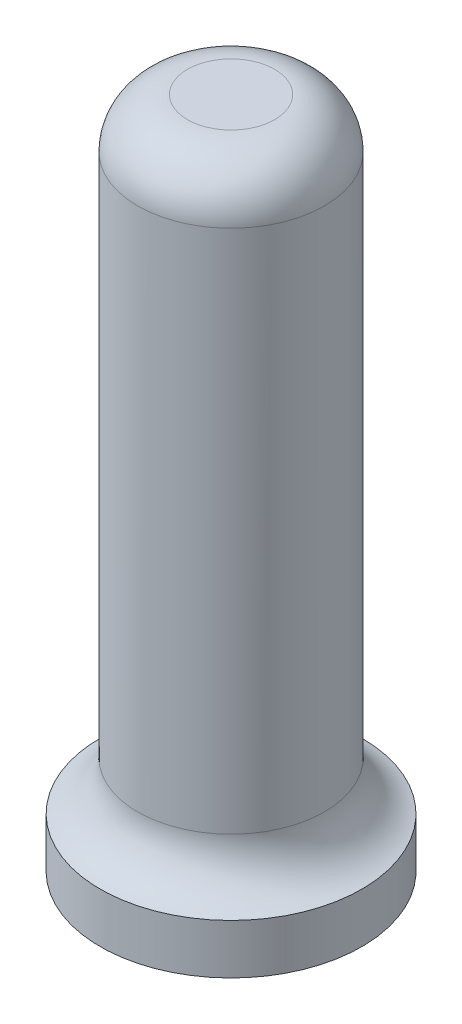
ISO-10303-21;
HEADER;
FILE_DESCRIPTION(('STEP AP214'),'2;1');
FILE_NAME('part.step','',(''),(''),'','','');
FILE_SCHEMA(('AUTOMOTIVE_DESIGN { 1 0 10303 214 1 1 1 1 }'));
ENDSEC;
DATA;
#1=APPLICATION_CONTEXT('core data for automotive mechanical design processes');
#2=APPLICATION_PROTOCOL_DEFINITION('international standard','automotive_design',2000,#1);
#3=PRODUCT_CONTEXT('',#1,'mechanical');
#4=PRODUCT('Part','Part','',(#3));
#5=PRODUCT_RELATED_PRODUCT_CATEGORY('part','',(#4));
#6=PRODUCT_DEFINITION_FORMATION('','',#4);
#7=PRODUCT_DEFINITION_CONTEXT('part definition',#1,'design');
#8=PRODUCT_DEFINITION('design','',#6,#7);
#9=PRODUCT_DEFINITION_SHAPE('','',#8);
#10=(LENGTH_UNIT() NAMED_UNIT(*) SI_UNIT(.MILLI.,.METRE.));
#11=(NAMED_UNIT(*) PLANE_ANGLE_UNIT() SI_UNIT($,.RADIAN.));
#12=(NAMED_UNIT(*) SI_UNIT($,.STERADIAN.) SOLID_ANGLE_UNIT());
#13=UNCERTAINTY_MEASURE_WITH_UNIT(LENGTH_MEASURE(1.E-05),#10,'distance_accuracy_value','');
#14=(GEOMETRIC_REPRESENTATION_CONTEXT(3) GLOBAL_UNCERTAINTY_ASSIGNED_CONTEXT((#13)) GLOBAL_UNIT_ASSIGNED_CONTEXT((#10,
#11,#12)) REPRESENTATION_CONTEXT('',''));
#15=CARTESIAN_POINT('',(0.,0.,0.));
#16=DIRECTION('',(0.,0.,1.));
#17=DIRECTION('',(1.,0.,0.));
#18=AXIS2_PLACEMENT_3D('',#15,#16,#17);
#19=CARTESIAN_POINT('',(0.,25.,0.));
#20=DIRECTION('',(0.,-1.,0.));
#21=DIRECTION('',(0.,0.,-1.));
#22=AXIS2_PLACEMENT_3D('',#19,#20,#21);
#23=CYLINDRICAL_SURFACE('',#22,3.75);
#24=CARTESIAN_POINT('',(0.,1.93649167310371,0.));
#25=DIRECTION('',(0.,-1.,0.));
#26=DIRECTION('',(0.,0.,-1.));
#27=AXIS2_PLACEMENT_3D('',#24,#25,#26);
#28=CIRCLE('',#27,3.75);
#29=CARTESIAN_POINT('',(0.,1.93649167310371,-3.75));
#30=VERTEX_POINT('',#29);
#31=EDGE_CURVE('E10',#30,#30,#28,.F.);
#32=ORIENTED_EDGE('',*,*,#31,.T.);
#33=EDGE_LOOP('',(#32));
#34=FACE_BOUND('',#33,.T.);
#35=CARTESIAN_POINT('',(0.,23.,0.));
#36=DIRECTION('',(0.,1.,0.));
#37=DIRECTION('',(0.,0.,1.));
#38=AXIS2_PLACEMENT_3D('',#35,#36,#37);
#39=CIRCLE('',#38,3.75);
#40=CARTESIAN_POINT('',(0.,23.,3.75));
#41=VERTEX_POINT('',#40);
#42=EDGE_CURVE('E38',#41,#41,#39,.F.);
#43=ORIENTED_EDGE('',*,*,#42,.T.);
#44=EDGE_LOOP('',(#43));
#45=FACE_BOUND('',#44,.T.);
#46=ADVANCED_FACE('F31',(#34,#45),#23,.T.);
#47=CARTESIAN_POINT('',(0.,25.,0.));
#48=DIRECTION('',(0.,1.,0.));
#49=DIRECTION('',(0.,0.,1.));
#50=AXIS2_PLACEMENT_3D('',#47,#48,#49);
#51=PLANE('',#50);
#52=CARTESIAN_POINT('',(0.,25.,0.));
#53=DIRECTION('',(0.,1.,0.));
#54=DIRECTION('',(0.,0.,1.));
#55=AXIS2_PLACEMENT_3D('',#52,#53,#54);
#56=CIRCLE('',#55,1.75);
#57=CARTESIAN_POINT('',(0.,25.,1.75));
#58=VERTEX_POINT('',#57);
#59=EDGE_CURVE('E42',#58,#58,#56,.T.);
#60=ORIENTED_EDGE('',*,*,#59,.T.);
#61=EDGE_LOOP('',(#60));
#62=FACE_BOUND('',#61,.T.);
#63=ADVANCED_FACE('F71',(#62),#51,.T.);
#64=CARTESIAN_POINT('',(0.,23.,0.));
#65=DIRECTION('',(0.,1.,0.));
#66=DIRECTION('',(0.,0.,1.));
#67=AXIS2_PLACEMENT_3D('',#64,#65,#66);
#68=DEGENERATE_TOROIDAL_SURFACE('',#67,1.75,2.,.T.);
#69=ORIENTED_EDGE('',*,*,#42,.F.);
#70=EDGE_LOOP('',(#69));
#71=FACE_BOUND('',#70,.T.);
#72=ORIENTED_EDGE('',*,*,#59,.F.);
#73=EDGE_LOOP('',(#72));
#74=FACE_BOUND('',#73,.T.);
#75=ADVANCED_FACE('F60',(#71,#74),#68,.T.);
#76=CARTESIAN_POINT('',(0.,-2.,0.));
#77=DIRECTION('',(0.,1.,0.));
#78=DIRECTION('',(0.,0.,1.));
#79=AXIS2_PLACEMENT_3D('',#76,#77,#78);
#80=CYLINDRICAL_SURFACE('',#79,5.25);
#81=CARTESIAN_POINT('',(0.,-2.,0.));
#82=DIRECTION('',(0.,-1.,0.));
#83=DIRECTION('',(0.,0.,-1.));
#84=AXIS2_PLACEMENT_3D('',#81,#82,#83);
#85=CIRCLE('',#84,5.25);
#86=CARTESIAN_POINT('',(0.,-2.,-5.25));
#87=VERTEX_POINT('',#86);
#88=EDGE_CURVE('E46',#87,#87,#85,.T.);
#89=ORIENTED_EDGE('',*,*,#88,.F.);
#90=EDGE_LOOP('',(#89));
#91=FACE_BOUND('',#90,.T.);
#92=CARTESIAN_POINT('',(0.,0.,0.));
#93=DIRECTION('',(0.,-1.,0.));
#94=DIRECTION('',(0.,0.,-1.));
#95=AXIS2_PLACEMENT_3D('',#92,#93,#94);
#96=CIRCLE('',#95,5.25);
#97=CARTESIAN_POINT('',(0.,0.,-5.25));
#98=VERTEX_POINT('',#97);
#99=EDGE_CURVE('E49',#98,#98,#96,.T.);
#100=ORIENTED_EDGE('',*,*,#99,.T.);
#101=EDGE_LOOP('',(#100));
#102=FACE_BOUND('',#101,.T.);
#103=ADVANCED_FACE('F57',(#91,#102),#80,.T.);
#104=CARTESIAN_POINT('',(0.,-2.,0.));
#105=DIRECTION('',(0.,-1.,0.));
#106=DIRECTION('',(0.,0.,-1.));
#107=AXIS2_PLACEMENT_3D('',#104,#105,#106);
#108=PLANE('',#107);
#109=ORIENTED_EDGE('',*,*,#88,.T.);
#110=EDGE_LOOP('',(#109));
#111=FACE_BOUND('',#110,.T.);
#112=ADVANCED_FACE('F55',(#111),#108,.T.);
#113=CARTESIAN_POINT('',(0.,1.93649167310371,0.));
#114=DIRECTION('',(0.,-1.,0.));
#115=DIRECTION('',(0.,0.,-1.));
#116=AXIS2_PLACEMENT_3D('',#113,#114,#115);
#117=TOROIDAL_SURFACE('',#116,5.75,2.);
#118=ORIENTED_EDGE('',*,*,#99,.F.);
#119=EDGE_LOOP('',(#118));
#120=FACE_BOUND('',#119,.T.);
#121=ORIENTED_EDGE('',*,*,#31,.F.);
#122=EDGE_LOOP('',(#121));
#123=FACE_BOUND('',#122,.T.);
#124=ADVANCED_FACE('F33',(#120,#123),#117,.F.);
#125=CLOSED_SHELL('',(#46,#63,#75,#103,#112,#124));
#126=MANIFOLD_SOLID_BREP('B2',#125);
#127=ADVANCED_BREP_SHAPE_REPRESENTATION('',(#18,#126),#14);
#128=SHAPE_DEFINITION_REPRESENTATION(#9,#127);
ENDSEC;
END-ISO-10303-21;
